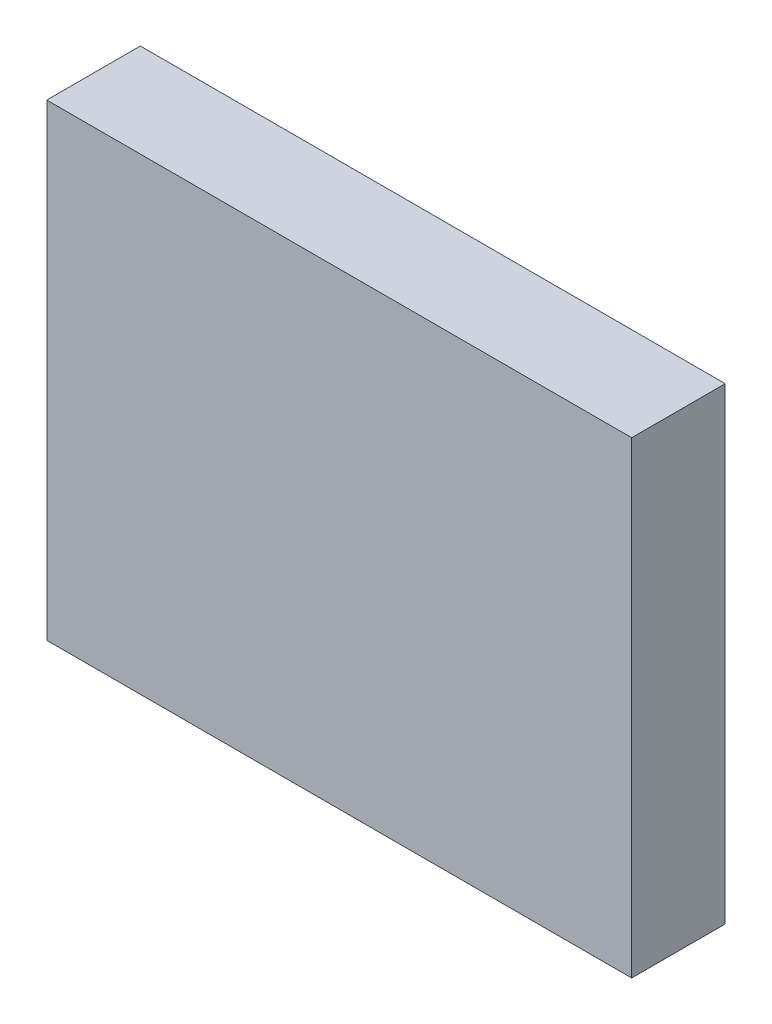
ISO-10303-21;
HEADER;
FILE_DESCRIPTION(('STEP AP214'),'2;1');
FILE_NAME('part.step','',(''),(''),'','','');
FILE_SCHEMA(('AUTOMOTIVE_DESIGN { 1 0 10303 214 1 1 1 1 }'));
ENDSEC;
DATA;
#1=APPLICATION_CONTEXT('core data for automotive mechanical design processes');
#2=APPLICATION_PROTOCOL_DEFINITION('international standard','automotive_design',2000,#1);
#3=PRODUCT_CONTEXT('',#1,'mechanical');
#4=PRODUCT('Part','Part','',(#3));
#5=PRODUCT_RELATED_PRODUCT_CATEGORY('part','',(#4));
#6=PRODUCT_DEFINITION_FORMATION('','',#4);
#7=PRODUCT_DEFINITION_CONTEXT('part definition',#1,'design');
#8=PRODUCT_DEFINITION('design','',#6,#7);
#9=PRODUCT_DEFINITION_SHAPE('','',#8);
#10=(LENGTH_UNIT() NAMED_UNIT(*) SI_UNIT(.MILLI.,.METRE.));
#11=(NAMED_UNIT(*) PLANE_ANGLE_UNIT() SI_UNIT($,.RADIAN.));
#12=(NAMED_UNIT(*) SI_UNIT($,.STERADIAN.) SOLID_ANGLE_UNIT());
#13=UNCERTAINTY_MEASURE_WITH_UNIT(LENGTH_MEASURE(1.E-05),#10,'distance_accuracy_value','');
#14=(GEOMETRIC_REPRESENTATION_CONTEXT(3) GLOBAL_UNCERTAINTY_ASSIGNED_CONTEXT((#13)) GLOBAL_UNIT_ASSIGNED_CONTEXT((#10,
#11,#12)) REPRESENTATION_CONTEXT('',''));
#15=CARTESIAN_POINT('',(0.,0.,0.));
#16=DIRECTION('',(0.,0.,1.));
#17=DIRECTION('',(1.,0.,0.));
#18=AXIS2_PLACEMENT_3D('',#15,#16,#17);
#19=CARTESIAN_POINT('',(25.,20.,8.));
#20=DIRECTION('',(-1.,0.,0.));
#21=DIRECTION('',(0.,0.,1.));
#22=AXIS2_PLACEMENT_3D('',#19,#20,#21);
#23=PLANE('',#22);
#24=DIRECTION('',(0.,1.,0.));
#25=VECTOR('',#24,1.);
#26=CARTESIAN_POINT('',(25.,20.,0.));
#27=LINE('',#26,#25);
#28=CARTESIAN_POINT('',(25.,-20.,0.));
#29=VERTEX_POINT('',#28);
#30=CARTESIAN_POINT('',(25.,20.,0.));
#31=VERTEX_POINT('',#30);
#32=EDGE_CURVE('E96',#29,#31,#27,.T.);
#33=ORIENTED_EDGE('',*,*,#32,.T.);
#34=DIRECTION('',(0.,0.,-1.));
#35=VECTOR('',#34,1.);
#36=CARTESIAN_POINT('',(25.,20.,8.));
#37=LINE('',#36,#35);
#38=CARTESIAN_POINT('',(25.,20.,8.));
#39=VERTEX_POINT('',#38);
#40=EDGE_CURVE('E11',#39,#31,#37,.T.);
#41=ORIENTED_EDGE('',*,*,#40,.F.);
#42=DIRECTION('',(0.,1.,0.));
#43=VECTOR('',#42,1.);
#44=CARTESIAN_POINT('',(25.,20.,8.));
#45=LINE('',#44,#43);
#46=CARTESIAN_POINT('',(25.,-20.,8.));
#47=VERTEX_POINT('',#46);
#48=EDGE_CURVE('E84',#47,#39,#45,.T.);
#49=ORIENTED_EDGE('',*,*,#48,.F.);
#50=DIRECTION('',(0.,0.,-1.));
#51=VECTOR('',#50,1.);
#52=CARTESIAN_POINT('',(25.,-20.,8.));
#53=LINE('',#52,#51);
#54=EDGE_CURVE('E92',#47,#29,#53,.T.);
#55=ORIENTED_EDGE('',*,*,#54,.T.);
#56=EDGE_LOOP('',(#33,#41,#49,#55));
#57=FACE_BOUND('',#56,.T.);
#58=ADVANCED_FACE('F33',(#57),#23,.F.);
#59=CARTESIAN_POINT('',(-25.,20.,8.));
#60=DIRECTION('',(0.,-1.,0.));
#61=DIRECTION('',(0.,0.,-1.));
#62=AXIS2_PLACEMENT_3D('',#59,#60,#61);
#63=PLANE('',#62);
#64=DIRECTION('',(-1.,0.,0.));
#65=VECTOR('',#64,1.);
#66=CARTESIAN_POINT('',(-25.,20.,0.));
#67=LINE('',#66,#65);
#68=CARTESIAN_POINT('',(-25.,20.,0.));
#69=VERTEX_POINT('',#68);
#70=EDGE_CURVE('E88',#31,#69,#67,.T.);
#71=ORIENTED_EDGE('',*,*,#70,.T.);
#72=DIRECTION('',(0.,0.,-1.));
#73=VECTOR('',#72,1.);
#74=CARTESIAN_POINT('',(-25.,20.,8.));
#75=LINE('',#74,#73);
#76=CARTESIAN_POINT('',(-25.,20.,8.));
#77=VERTEX_POINT('',#76);
#78=EDGE_CURVE('E41',#77,#69,#75,.T.);
#79=ORIENTED_EDGE('',*,*,#78,.F.);
#80=DIRECTION('',(-1.,0.,0.));
#81=VECTOR('',#80,1.);
#82=CARTESIAN_POINT('',(-25.,20.,8.));
#83=LINE('',#82,#81);
#84=EDGE_CURVE('E79',#39,#77,#83,.T.);
#85=ORIENTED_EDGE('',*,*,#84,.F.);
#86=ORIENTED_EDGE('',*,*,#40,.T.);
#87=EDGE_LOOP('',(#71,#79,#85,#86));
#88=FACE_BOUND('',#87,.T.);
#89=ADVANCED_FACE('F87',(#88),#63,.F.);
#90=CARTESIAN_POINT('',(-25.,20.,8.));
#91=DIRECTION('',(1.,0.,0.));
#92=DIRECTION('',(0.,1.,0.));
#93=AXIS2_PLACEMENT_3D('',#90,#91,#92);
#94=PLANE('',#93);
#95=DIRECTION('',(0.,-1.,0.));
#96=VECTOR('',#95,1.);
#97=CARTESIAN_POINT('',(-25.,20.,0.));
#98=LINE('',#97,#96);
#99=CARTESIAN_POINT('',(-25.,-20.,0.));
#100=VERTEX_POINT('',#99);
#101=EDGE_CURVE('E66',#69,#100,#98,.T.);
#102=ORIENTED_EDGE('',*,*,#101,.T.);
#103=DIRECTION('',(0.,0.,-1.));
#104=VECTOR('',#103,1.);
#105=CARTESIAN_POINT('',(-25.,-20.,8.));
#106=LINE('',#105,#104);
#107=CARTESIAN_POINT('',(-25.,-20.,8.));
#108=VERTEX_POINT('',#107);
#109=EDGE_CURVE('E89',#108,#100,#106,.T.);
#110=ORIENTED_EDGE('',*,*,#109,.F.);
#111=DIRECTION('',(0.,-1.,0.));
#112=VECTOR('',#111,1.);
#113=CARTESIAN_POINT('',(-25.,20.,8.));
#114=LINE('',#113,#112);
#115=EDGE_CURVE('E82',#77,#108,#114,.T.);
#116=ORIENTED_EDGE('',*,*,#115,.F.);
#117=ORIENTED_EDGE('',*,*,#78,.T.);
#118=EDGE_LOOP('',(#102,#110,#116,#117));
#119=FACE_BOUND('',#118,.T.);
#120=ADVANCED_FACE('F90',(#119),#94,.F.);
#121=CARTESIAN_POINT('',(-25.,-20.,8.));
#122=DIRECTION('',(0.,1.,0.));
#123=DIRECTION('',(0.,0.,1.));
#124=AXIS2_PLACEMENT_3D('',#121,#122,#123);
#125=PLANE('',#124);
#126=DIRECTION('',(1.,0.,0.));
#127=VECTOR('',#126,1.);
#128=CARTESIAN_POINT('',(-25.,-20.,0.));
#129=LINE('',#128,#127);
#130=EDGE_CURVE('E72',#100,#29,#129,.T.);
#131=ORIENTED_EDGE('',*,*,#130,.T.);
#132=ORIENTED_EDGE('',*,*,#54,.F.);
#133=DIRECTION('',(1.,0.,0.));
#134=VECTOR('',#133,1.);
#135=CARTESIAN_POINT('',(-25.,-20.,8.));
#136=LINE('',#135,#134);
#137=EDGE_CURVE('E49',#108,#47,#136,.T.);
#138=ORIENTED_EDGE('',*,*,#137,.F.);
#139=ORIENTED_EDGE('',*,*,#109,.T.);
#140=EDGE_LOOP('',(#131,#132,#138,#139));
#141=FACE_BOUND('',#140,.T.);
#142=ADVANCED_FACE('F103',(#141),#125,.F.);
#143=CARTESIAN_POINT('',(0.,0.,8.));
#144=DIRECTION('',(0.,0.,1.));
#145=DIRECTION('',(1.,0.,0.));
#146=AXIS2_PLACEMENT_3D('',#143,#144,#145);
#147=PLANE('',#146);
#148=ORIENTED_EDGE('',*,*,#48,.T.);
#149=ORIENTED_EDGE('',*,*,#84,.T.);
#150=ORIENTED_EDGE('',*,*,#115,.T.);
#151=ORIENTED_EDGE('',*,*,#137,.T.);
#152=EDGE_LOOP('',(#148,#149,#150,#151));
#153=FACE_BOUND('',#152,.T.);
#154=ADVANCED_FACE('F80',(#153),#147,.T.);
#155=CARTESIAN_POINT('',(0.,0.,0.));
#156=DIRECTION('',(0.,0.,1.));
#157=DIRECTION('',(1.,0.,0.));
#158=AXIS2_PLACEMENT_3D('',#155,#156,#157);
#159=PLANE('',#158);
#160=ORIENTED_EDGE('',*,*,#32,.F.);
#161=ORIENTED_EDGE('',*,*,#130,.F.);
#162=ORIENTED_EDGE('',*,*,#101,.F.);
#163=ORIENTED_EDGE('',*,*,#70,.F.);
#164=EDGE_LOOP('',(#160,#161,#162,#163));
#165=FACE_BOUND('',#164,.T.);
#166=ADVANCED_FACE('F106',(#165),#159,.F.);
#167=CLOSED_SHELL('',(#58,#89,#120,#142,#154,#166));
#168=MANIFOLD_SOLID_BREP('B2',#167);
#169=ADVANCED_BREP_SHAPE_REPRESENTATION('',(#18,#168),#14);
#170=SHAPE_DEFINITION_REPRESENTATION(#9,#169);
ENDSEC;
END-ISO-10303-21;
